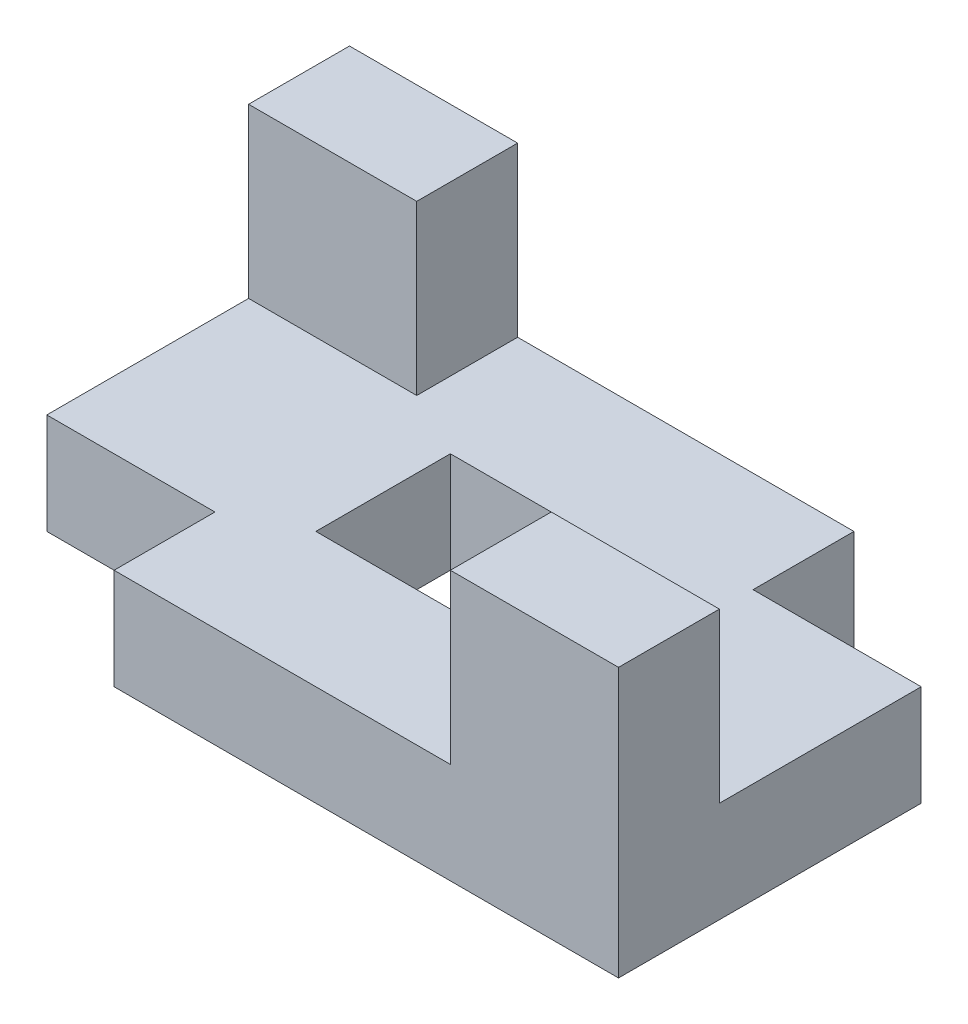
ISO-10303-21;
HEADER;
FILE_DESCRIPTION(('STEP AP214'),'2;1');
FILE_NAME('part.step','',(''),(''),'','','');
FILE_SCHEMA(('AUTOMOTIVE_DESIGN { 1 0 10303 214 1 1 1 1 }'));
ENDSEC;
DATA;
#1=APPLICATION_CONTEXT('core data for automotive mechanical design processes');
#2=APPLICATION_PROTOCOL_DEFINITION('international standard','automotive_design',2000,#1);
#3=PRODUCT_CONTEXT('',#1,'mechanical');
#4=PRODUCT('Part','Part','',(#3));
#5=PRODUCT_RELATED_PRODUCT_CATEGORY('part','',(#4));
#6=PRODUCT_DEFINITION_FORMATION('','',#4);
#7=PRODUCT_DEFINITION_CONTEXT('part definition',#1,'design');
#8=PRODUCT_DEFINITION('design','',#6,#7);
#9=PRODUCT_DEFINITION_SHAPE('','',#8);
#10=(LENGTH_UNIT() NAMED_UNIT(*) SI_UNIT(.MILLI.,.METRE.));
#11=(NAMED_UNIT(*) PLANE_ANGLE_UNIT() SI_UNIT($,.RADIAN.));
#12=(NAMED_UNIT(*) SI_UNIT($,.STERADIAN.) SOLID_ANGLE_UNIT());
#13=UNCERTAINTY_MEASURE_WITH_UNIT(LENGTH_MEASURE(1.E-05),#10,'distance_accuracy_value','');
#14=(GEOMETRIC_REPRESENTATION_CONTEXT(3) GLOBAL_UNCERTAINTY_ASSIGNED_CONTEXT((#13)) GLOBAL_UNIT_ASSIGNED_CONTEXT((#10,
#11,#12)) REPRESENTATION_CONTEXT('',''));
#15=CARTESIAN_POINT('',(0.,0.,0.));
#16=DIRECTION('',(0.,0.,1.));
#17=DIRECTION('',(1.,0.,0.));
#18=AXIS2_PLACEMENT_3D('',#15,#16,#17);
#19=CARTESIAN_POINT('',(-50.,15.,30.));
#20=DIRECTION('',(0.,0.,-1.));
#21=DIRECTION('',(-1.,0.,0.));
#22=AXIS2_PLACEMENT_3D('',#19,#20,#21);
#23=PLANE('',#22);
#24=DIRECTION('',(0.,1.,0.));
#25=VECTOR('',#24,1.);
#26=CARTESIAN_POINT('',(-25.,-8.,30.));
#27=LINE('',#26,#25);
#28=CARTESIAN_POINT('',(-25.,0.,30.));
#29=VERTEX_POINT('',#28);
#30=CARTESIAN_POINT('',(-25.,15.,30.));
#31=VERTEX_POINT('',#30);
#32=EDGE_CURVE('E203',#29,#31,#27,.T.);
#33=ORIENTED_EDGE('',*,*,#32,.F.);
#34=DIRECTION('',(1.,0.,0.));
#35=VECTOR('',#34,1.);
#36=CARTESIAN_POINT('',(-50.,0.,30.));
#37=LINE('',#36,#35);
#38=CARTESIAN_POINT('',(50.,0.,30.));
#39=VERTEX_POINT('',#38);
#40=EDGE_CURVE('E285',#29,#39,#37,.T.);
#41=ORIENTED_EDGE('',*,*,#40,.T.);
#42=DIRECTION('',(0.,-1.,0.));
#43=VECTOR('',#42,1.);
#44=CARTESIAN_POINT('',(50.,15.,30.));
#45=LINE('',#44,#43);
#46=CARTESIAN_POINT('',(50.,40.,30.));
#47=VERTEX_POINT('',#46);
#48=EDGE_CURVE('E292',#47,#39,#45,.T.);
#49=ORIENTED_EDGE('',*,*,#48,.F.);
#50=DIRECTION('',(1.,0.,0.));
#51=VECTOR('',#50,1.);
#52=CARTESIAN_POINT('',(50.,40.,30.));
#53=LINE('',#52,#51);
#54=CARTESIAN_POINT('',(25.,40.,30.));
#55=VERTEX_POINT('',#54);
#56=EDGE_CURVE('E255',#55,#47,#53,.T.);
#57=ORIENTED_EDGE('',*,*,#56,.F.);
#58=DIRECTION('',(0.,-1.,0.));
#59=VECTOR('',#58,1.);
#60=CARTESIAN_POINT('',(25.,40.,30.));
#61=LINE('',#60,#59);
#62=CARTESIAN_POINT('',(25.,15.,30.));
#63=VERTEX_POINT('',#62);
#64=EDGE_CURVE('E253',#55,#63,#61,.T.);
#65=ORIENTED_EDGE('',*,*,#64,.T.);
#66=DIRECTION('',(1.,0.,0.));
#67=VECTOR('',#66,1.);
#68=CARTESIAN_POINT('',(-50.,15.,30.));
#69=LINE('',#68,#67);
#70=EDGE_CURVE('E275',#31,#63,#69,.T.);
#71=ORIENTED_EDGE('',*,*,#70,.F.);
#72=EDGE_LOOP('',(#33,#41,#49,#57,#65,#71));
#73=FACE_BOUND('',#72,.T.);
#74=ADVANCED_FACE('F41',(#73),#23,.F.);
#75=CARTESIAN_POINT('',(50.,15.,-30.));
#76=DIRECTION('',(1.,0.,0.));
#77=DIRECTION('',(0.,0.,-1.));
#78=AXIS2_PLACEMENT_3D('',#75,#76,#77);
#79=PLANE('',#78);
#80=DIRECTION('',(0.,0.,1.));
#81=VECTOR('',#80,1.);
#82=CARTESIAN_POINT('',(50.,0.,-30.));
#83=LINE('',#82,#81);
#84=CARTESIAN_POINT('',(50.,0.,-15.));
#85=VERTEX_POINT('',#84);
#86=EDGE_CURVE('E282',#85,#39,#83,.T.);
#87=ORIENTED_EDGE('',*,*,#86,.F.);
#88=DIRECTION('',(0.,1.,0.));
#89=VECTOR('',#88,1.);
#90=CARTESIAN_POINT('',(50.,-8.,-15.));
#91=LINE('',#90,#89);
#92=CARTESIAN_POINT('',(50.,15.,-15.));
#93=VERTEX_POINT('',#92);
#94=EDGE_CURVE('E195',#85,#93,#91,.T.);
#95=ORIENTED_EDGE('',*,*,#94,.T.);
#96=DIRECTION('',(0.,0.,1.));
#97=VECTOR('',#96,1.);
#98=CARTESIAN_POINT('',(50.,15.,-30.));
#99=LINE('',#98,#97);
#100=CARTESIAN_POINT('',(50.,15.,15.));
#101=VERTEX_POINT('',#100);
#102=EDGE_CURVE('E274',#93,#101,#99,.T.);
#103=ORIENTED_EDGE('',*,*,#102,.T.);
#104=DIRECTION('',(0.,-1.,0.));
#105=VECTOR('',#104,1.);
#106=CARTESIAN_POINT('',(50.,40.,15.));
#107=LINE('',#106,#105);
#108=CARTESIAN_POINT('',(50.,40.,15.));
#109=VERTEX_POINT('',#108);
#110=EDGE_CURVE('E202',#109,#101,#107,.T.);
#111=ORIENTED_EDGE('',*,*,#110,.F.);
#112=DIRECTION('',(0.,0.,-1.));
#113=VECTOR('',#112,1.);
#114=CARTESIAN_POINT('',(50.,40.,30.));
#115=LINE('',#114,#113);
#116=EDGE_CURVE('E256',#47,#109,#115,.T.);
#117=ORIENTED_EDGE('',*,*,#116,.F.);
#118=ORIENTED_EDGE('',*,*,#48,.T.);
#119=EDGE_LOOP('',(#87,#95,#103,#111,#117,#118));
#120=FACE_BOUND('',#119,.T.);
#121=ADVANCED_FACE('F332',(#120),#79,.T.);
#122=CARTESIAN_POINT('',(-50.,15.,-30.));
#123=DIRECTION('',(1.,0.,0.));
#124=DIRECTION('',(0.,0.,-1.));
#125=AXIS2_PLACEMENT_3D('',#122,#123,#124);
#126=PLANE('',#125);
#127=DIRECTION('',(0.,0.,1.));
#128=VECTOR('',#127,1.);
#129=CARTESIAN_POINT('',(-50.,0.,-30.));
#130=LINE('',#129,#128);
#131=CARTESIAN_POINT('',(-50.,0.,-30.));
#132=VERTEX_POINT('',#131);
#133=CARTESIAN_POINT('',(-50.,0.,15.));
#134=VERTEX_POINT('',#133);
#135=EDGE_CURVE('E242',#132,#134,#130,.T.);
#136=ORIENTED_EDGE('',*,*,#135,.T.);
#137=DIRECTION('',(0.,1.,0.));
#138=VECTOR('',#137,1.);
#139=CARTESIAN_POINT('',(-50.,-8.,15.));
#140=LINE('',#139,#138);
#141=CARTESIAN_POINT('',(-50.,15.,15.));
#142=VERTEX_POINT('',#141);
#143=EDGE_CURVE('E205',#134,#142,#140,.T.);
#144=ORIENTED_EDGE('',*,*,#143,.T.);
#145=DIRECTION('',(0.,0.,1.));
#146=VECTOR('',#145,1.);
#147=CARTESIAN_POINT('',(-50.,15.,-30.));
#148=LINE('',#147,#146);
#149=CARTESIAN_POINT('',(-50.,15.,-15.));
#150=VERTEX_POINT('',#149);
#151=EDGE_CURVE('E267',#150,#142,#148,.T.);
#152=ORIENTED_EDGE('',*,*,#151,.F.);
#153=DIRECTION('',(0.,-1.,0.));
#154=VECTOR('',#153,1.);
#155=CARTESIAN_POINT('',(-50.,40.,-15.));
#156=LINE('',#155,#154);
#157=CARTESIAN_POINT('',(-50.,40.,-15.));
#158=VERTEX_POINT('',#157);
#159=EDGE_CURVE('E241',#158,#150,#156,.T.);
#160=ORIENTED_EDGE('',*,*,#159,.F.);
#161=DIRECTION('',(0.,0.,1.));
#162=VECTOR('',#161,1.);
#163=CARTESIAN_POINT('',(-50.,40.,-30.));
#164=LINE('',#163,#162);
#165=CARTESIAN_POINT('',(-50.,40.,-30.));
#166=VERTEX_POINT('',#165);
#167=EDGE_CURVE('E218',#166,#158,#164,.T.);
#168=ORIENTED_EDGE('',*,*,#167,.F.);
#169=DIRECTION('',(0.,-1.,0.));
#170=VECTOR('',#169,1.);
#171=CARTESIAN_POINT('',(-50.,15.,-30.));
#172=LINE('',#171,#170);
#173=EDGE_CURVE('E278',#166,#132,#172,.T.);
#174=ORIENTED_EDGE('',*,*,#173,.T.);
#175=EDGE_LOOP('',(#136,#144,#152,#160,#168,#174));
#176=FACE_BOUND('',#175,.T.);
#177=ADVANCED_FACE('F43',(#176),#126,.F.);
#178=CARTESIAN_POINT('',(-50.,15.,-30.));
#179=DIRECTION('',(0.,0.,-1.));
#180=DIRECTION('',(-1.,0.,0.));
#181=AXIS2_PLACEMENT_3D('',#178,#179,#180);
#182=PLANE('',#181);
#183=DIRECTION('',(0.,1.,0.));
#184=VECTOR('',#183,1.);
#185=CARTESIAN_POINT('',(25.,-8.,-30.));
#186=LINE('',#185,#184);
#187=CARTESIAN_POINT('',(25.,0.,-30.));
#188=VERTEX_POINT('',#187);
#189=CARTESIAN_POINT('',(25.,15.,-30.));
#190=VERTEX_POINT('',#189);
#191=EDGE_CURVE('E207',#188,#190,#186,.T.);
#192=ORIENTED_EDGE('',*,*,#191,.F.);
#193=DIRECTION('',(1.,0.,0.));
#194=VECTOR('',#193,1.);
#195=CARTESIAN_POINT('',(-50.,0.,-30.));
#196=LINE('',#195,#194);
#197=EDGE_CURVE('E272',#132,#188,#196,.T.);
#198=ORIENTED_EDGE('',*,*,#197,.F.);
#199=ORIENTED_EDGE('',*,*,#173,.F.);
#200=DIRECTION('',(-1.,0.,0.));
#201=VECTOR('',#200,1.);
#202=CARTESIAN_POINT('',(-50.,40.,-30.));
#203=LINE('',#202,#201);
#204=CARTESIAN_POINT('',(-25.,40.,-30.));
#205=VERTEX_POINT('',#204);
#206=EDGE_CURVE('E226',#205,#166,#203,.T.);
#207=ORIENTED_EDGE('',*,*,#206,.F.);
#208=DIRECTION('',(0.,-1.,0.));
#209=VECTOR('',#208,1.);
#210=CARTESIAN_POINT('',(-25.,40.,-30.));
#211=LINE('',#210,#209);
#212=CARTESIAN_POINT('',(-25.,15.,-30.));
#213=VERTEX_POINT('',#212);
#214=EDGE_CURVE('E227',#205,#213,#211,.T.);
#215=ORIENTED_EDGE('',*,*,#214,.T.);
#216=DIRECTION('',(1.,0.,0.));
#217=VECTOR('',#216,1.);
#218=CARTESIAN_POINT('',(-50.,15.,-30.));
#219=LINE('',#218,#217);
#220=EDGE_CURVE('E280',#213,#190,#219,.T.);
#221=ORIENTED_EDGE('',*,*,#220,.T.);
#222=EDGE_LOOP('',(#192,#198,#199,#207,#215,#221));
#223=FACE_BOUND('',#222,.T.);
#224=ADVANCED_FACE('F341',(#223),#182,.T.);
#225=CARTESIAN_POINT('',(0.,15.,0.));
#226=DIRECTION('',(0.,1.,0.));
#227=DIRECTION('',(0.,0.,1.));
#228=AXIS2_PLACEMENT_3D('',#225,#226,#227);
#229=PLANE('',#228);
#230=DIRECTION('',(0.,0.,1.));
#231=VECTOR('',#230,1.);
#232=CARTESIAN_POINT('',(-15.,15.,-10.));
#233=LINE('',#232,#231);
#234=CARTESIAN_POINT('',(-15.,15.,-10.));
#235=VERTEX_POINT('',#234);
#236=CARTESIAN_POINT('',(-15.,15.,10.));
#237=VERTEX_POINT('',#236);
#238=EDGE_CURVE('E57',#235,#237,#233,.T.);
#239=ORIENTED_EDGE('',*,*,#238,.F.);
#240=DIRECTION('',(1.,0.,0.));
#241=VECTOR('',#240,1.);
#242=CARTESIAN_POINT('',(-15.,15.,-10.));
#243=LINE('',#242,#241);
#244=CARTESIAN_POINT('',(15.,15.,-10.));
#245=VERTEX_POINT('',#244);
#246=EDGE_CURVE('E183',#235,#245,#243,.T.);
#247=ORIENTED_EDGE('',*,*,#246,.T.);
#248=DIRECTION('',(0.,0.,1.));
#249=VECTOR('',#248,1.);
#250=CARTESIAN_POINT('',(15.,15.,-10.));
#251=LINE('',#250,#249);
#252=CARTESIAN_POINT('',(15.,15.,10.));
#253=VERTEX_POINT('',#252);
#254=EDGE_CURVE('E166',#245,#253,#251,.T.);
#255=ORIENTED_EDGE('',*,*,#254,.T.);
#256=DIRECTION('',(1.,0.,0.));
#257=VECTOR('',#256,1.);
#258=CARTESIAN_POINT('',(-15.,15.,10.));
#259=LINE('',#258,#257);
#260=EDGE_CURVE('E177',#237,#253,#259,.T.);
#261=ORIENTED_EDGE('',*,*,#260,.F.);
#262=EDGE_LOOP('',(#239,#247,#255,#261));
#263=FACE_BOUND('',#262,.T.);
#264=DIRECTION('',(0.,0.,-1.));
#265=VECTOR('',#264,1.);
#266=CARTESIAN_POINT('',(-25.,15.,30.));
#267=LINE('',#266,#265);
#268=CARTESIAN_POINT('',(-25.,15.,15.));
#269=VERTEX_POINT('',#268);
#270=EDGE_CURVE('E194',#31,#269,#267,.T.);
#271=ORIENTED_EDGE('',*,*,#270,.F.);
#272=ORIENTED_EDGE('',*,*,#70,.T.);
#273=DIRECTION('',(0.,0.,1.));
#274=VECTOR('',#273,1.);
#275=CARTESIAN_POINT('',(25.,15.,30.));
#276=LINE('',#275,#274);
#277=CARTESIAN_POINT('',(25.,15.,15.));
#278=VERTEX_POINT('',#277);
#279=EDGE_CURVE('E254',#278,#63,#276,.T.);
#280=ORIENTED_EDGE('',*,*,#279,.F.);
#281=DIRECTION('',(-1.,0.,0.));
#282=VECTOR('',#281,1.);
#283=CARTESIAN_POINT('',(50.,15.,15.));
#284=LINE('',#283,#282);
#285=EDGE_CURVE('E233',#101,#278,#284,.T.);
#286=ORIENTED_EDGE('',*,*,#285,.F.);
#287=ORIENTED_EDGE('',*,*,#102,.F.);
#288=DIRECTION('',(1.,0.,0.));
#289=VECTOR('',#288,1.);
#290=CARTESIAN_POINT('',(50.,15.,-15.));
#291=LINE('',#290,#289);
#292=CARTESIAN_POINT('',(25.,15.,-15.));
#293=VERTEX_POINT('',#292);
#294=EDGE_CURVE('E211',#293,#93,#291,.T.);
#295=ORIENTED_EDGE('',*,*,#294,.F.);
#296=DIRECTION('',(0.,0.,1.));
#297=VECTOR('',#296,1.);
#298=CARTESIAN_POINT('',(25.,15.,-30.));
#299=LINE('',#298,#297);
#300=EDGE_CURVE('E200',#190,#293,#299,.T.);
#301=ORIENTED_EDGE('',*,*,#300,.F.);
#302=ORIENTED_EDGE('',*,*,#220,.F.);
#303=DIRECTION('',(0.,0.,-1.));
#304=VECTOR('',#303,1.);
#305=CARTESIAN_POINT('',(-25.,15.,-30.));
#306=LINE('',#305,#304);
#307=CARTESIAN_POINT('',(-25.,15.,-15.));
#308=VERTEX_POINT('',#307);
#309=EDGE_CURVE('E224',#308,#213,#306,.T.);
#310=ORIENTED_EDGE('',*,*,#309,.F.);
#311=DIRECTION('',(1.,0.,0.));
#312=VECTOR('',#311,1.);
#313=CARTESIAN_POINT('',(-50.,15.,-15.));
#314=LINE('',#313,#312);
#315=EDGE_CURVE('E231',#150,#308,#314,.T.);
#316=ORIENTED_EDGE('',*,*,#315,.F.);
#317=ORIENTED_EDGE('',*,*,#151,.T.);
#318=DIRECTION('',(-1.,0.,0.));
#319=VECTOR('',#318,1.);
#320=CARTESIAN_POINT('',(-50.,15.,15.));
#321=LINE('',#320,#319);
#322=EDGE_CURVE('E196',#269,#142,#321,.T.);
#323=ORIENTED_EDGE('',*,*,#322,.F.);
#324=EDGE_LOOP('',(#271,#272,#280,#286,#287,#295,#301,#302,#310,#316,#317,#323));
#325=FACE_BOUND('',#324,.T.);
#326=ADVANCED_FACE('F185',(#263,#325),#229,.T.);
#327=CARTESIAN_POINT('',(0.,0.,0.));
#328=DIRECTION('',(0.,1.,0.));
#329=DIRECTION('',(0.,0.,1.));
#330=AXIS2_PLACEMENT_3D('',#327,#328,#329);
#331=PLANE('',#330);
#332=DIRECTION('',(1.,0.,0.));
#333=VECTOR('',#332,1.);
#334=CARTESIAN_POINT('',(0.,0.,-10.));
#335=LINE('',#334,#333);
#336=CARTESIAN_POINT('',(-15.,0.,-10.));
#337=VERTEX_POINT('',#336);
#338=CARTESIAN_POINT('',(15.,0.,-10.));
#339=VERTEX_POINT('',#338);
#340=EDGE_CURVE('E47',#337,#339,#335,.T.);
#341=ORIENTED_EDGE('',*,*,#340,.F.);
#342=DIRECTION('',(0.,0.,1.));
#343=VECTOR('',#342,1.);
#344=CARTESIAN_POINT('',(-15.,0.,0.));
#345=LINE('',#344,#343);
#346=CARTESIAN_POINT('',(-15.,0.,10.));
#347=VERTEX_POINT('',#346);
#348=EDGE_CURVE('E11',#337,#347,#345,.T.);
#349=ORIENTED_EDGE('',*,*,#348,.T.);
#350=DIRECTION('',(1.,0.,0.));
#351=VECTOR('',#350,1.);
#352=CARTESIAN_POINT('',(0.,0.,10.));
#353=LINE('',#352,#351);
#354=CARTESIAN_POINT('',(15.,0.,10.));
#355=VERTEX_POINT('',#354);
#356=EDGE_CURVE('E308',#347,#355,#353,.T.);
#357=ORIENTED_EDGE('',*,*,#356,.T.);
#358=DIRECTION('',(0.,0.,1.));
#359=VECTOR('',#358,1.);
#360=CARTESIAN_POINT('',(15.,0.,0.));
#361=LINE('',#360,#359);
#362=EDGE_CURVE('E171',#339,#355,#361,.T.);
#363=ORIENTED_EDGE('',*,*,#362,.F.);
#364=EDGE_LOOP('',(#341,#349,#357,#363));
#365=FACE_BOUND('',#364,.T.);
#366=DIRECTION('',(0.,0.,-1.));
#367=VECTOR('',#366,1.);
#368=CARTESIAN_POINT('',(-25.,0.,0.));
#369=LINE('',#368,#367);
#370=CARTESIAN_POINT('',(-25.,0.,15.));
#371=VERTEX_POINT('',#370);
#372=EDGE_CURVE('E297',#29,#371,#369,.T.);
#373=ORIENTED_EDGE('',*,*,#372,.T.);
#374=DIRECTION('',(-1.,0.,0.));
#375=VECTOR('',#374,1.);
#376=CARTESIAN_POINT('',(0.,0.,15.));
#377=LINE('',#376,#375);
#378=EDGE_CURVE('E302',#371,#134,#377,.T.);
#379=ORIENTED_EDGE('',*,*,#378,.T.);
#380=ORIENTED_EDGE('',*,*,#135,.F.);
#381=ORIENTED_EDGE('',*,*,#197,.T.);
#382=DIRECTION('',(0.,0.,1.));
#383=VECTOR('',#382,1.);
#384=CARTESIAN_POINT('',(25.,0.,0.));
#385=LINE('',#384,#383);
#386=CARTESIAN_POINT('',(25.,0.,-15.));
#387=VERTEX_POINT('',#386);
#388=EDGE_CURVE('E294',#188,#387,#385,.T.);
#389=ORIENTED_EDGE('',*,*,#388,.T.);
#390=DIRECTION('',(1.,0.,0.));
#391=VECTOR('',#390,1.);
#392=CARTESIAN_POINT('',(0.,0.,-15.));
#393=LINE('',#392,#391);
#394=EDGE_CURVE('E296',#387,#85,#393,.T.);
#395=ORIENTED_EDGE('',*,*,#394,.T.);
#396=ORIENTED_EDGE('',*,*,#86,.T.);
#397=ORIENTED_EDGE('',*,*,#40,.F.);
#398=EDGE_LOOP('',(#373,#379,#380,#381,#389,#395,#396,#397));
#399=FACE_BOUND('',#398,.T.);
#400=ADVANCED_FACE('F311',(#365,#399),#331,.F.);
#401=CARTESIAN_POINT('',(50.,40.,15.));
#402=DIRECTION('',(0.,0.,1.));
#403=DIRECTION('',(1.,0.,0.));
#404=AXIS2_PLACEMENT_3D('',#401,#402,#403);
#405=PLANE('',#404);
#406=ORIENTED_EDGE('',*,*,#285,.T.);
#407=DIRECTION('',(0.,-1.,0.));
#408=VECTOR('',#407,1.);
#409=CARTESIAN_POINT('',(25.,40.,15.));
#410=LINE('',#409,#408);
#411=CARTESIAN_POINT('',(25.,40.,15.));
#412=VERTEX_POINT('',#411);
#413=EDGE_CURVE('E247',#412,#278,#410,.T.);
#414=ORIENTED_EDGE('',*,*,#413,.F.);
#415=DIRECTION('',(-1.,0.,0.));
#416=VECTOR('',#415,1.);
#417=CARTESIAN_POINT('',(50.,40.,15.));
#418=LINE('',#417,#416);
#419=EDGE_CURVE('E264',#109,#412,#418,.T.);
#420=ORIENTED_EDGE('',*,*,#419,.F.);
#421=ORIENTED_EDGE('',*,*,#110,.T.);
#422=EDGE_LOOP('',(#406,#414,#420,#421));
#423=FACE_BOUND('',#422,.T.);
#424=ADVANCED_FACE('F347',(#423),#405,.F.);
#425=CARTESIAN_POINT('',(25.,40.,30.));
#426=DIRECTION('',(1.,0.,0.));
#427=DIRECTION('',(0.,0.,-1.));
#428=AXIS2_PLACEMENT_3D('',#425,#426,#427);
#429=PLANE('',#428);
#430=ORIENTED_EDGE('',*,*,#279,.T.);
#431=ORIENTED_EDGE('',*,*,#64,.F.);
#432=DIRECTION('',(0.,0.,1.));
#433=VECTOR('',#432,1.);
#434=CARTESIAN_POINT('',(25.,40.,30.));
#435=LINE('',#434,#433);
#436=EDGE_CURVE('E263',#412,#55,#435,.T.);
#437=ORIENTED_EDGE('',*,*,#436,.F.);
#438=ORIENTED_EDGE('',*,*,#413,.T.);
#439=EDGE_LOOP('',(#430,#431,#437,#438));
#440=FACE_BOUND('',#439,.T.);
#441=ADVANCED_FACE('F355',(#440),#429,.F.);
#442=CARTESIAN_POINT('',(0.,40.,0.));
#443=DIRECTION('',(0.,1.,0.));
#444=DIRECTION('',(0.,0.,1.));
#445=AXIS2_PLACEMENT_3D('',#442,#443,#444);
#446=PLANE('',#445);
#447=ORIENTED_EDGE('',*,*,#116,.T.);
#448=ORIENTED_EDGE('',*,*,#419,.T.);
#449=ORIENTED_EDGE('',*,*,#436,.T.);
#450=ORIENTED_EDGE('',*,*,#56,.T.);
#451=EDGE_LOOP('',(#447,#448,#449,#450));
#452=FACE_BOUND('',#451,.T.);
#453=ADVANCED_FACE('F349',(#452),#446,.T.);
#454=CARTESIAN_POINT('',(-50.,40.,-15.));
#455=DIRECTION('',(0.,0.,-1.));
#456=DIRECTION('',(-1.,0.,0.));
#457=AXIS2_PLACEMENT_3D('',#454,#455,#456);
#458=PLANE('',#457);
#459=ORIENTED_EDGE('',*,*,#315,.T.);
#460=DIRECTION('',(0.,-1.,0.));
#461=VECTOR('',#460,1.);
#462=CARTESIAN_POINT('',(-25.,40.,-15.));
#463=LINE('',#462,#461);
#464=CARTESIAN_POINT('',(-25.,40.,-15.));
#465=VERTEX_POINT('',#464);
#466=EDGE_CURVE('E239',#465,#308,#463,.T.);
#467=ORIENTED_EDGE('',*,*,#466,.F.);
#468=DIRECTION('',(1.,0.,0.));
#469=VECTOR('',#468,1.);
#470=CARTESIAN_POINT('',(-50.,40.,-15.));
#471=LINE('',#470,#469);
#472=EDGE_CURVE('E225',#158,#465,#471,.T.);
#473=ORIENTED_EDGE('',*,*,#472,.F.);
#474=ORIENTED_EDGE('',*,*,#159,.T.);
#475=EDGE_LOOP('',(#459,#467,#473,#474));
#476=FACE_BOUND('',#475,.T.);
#477=ADVANCED_FACE('F351',(#476),#458,.F.);
#478=CARTESIAN_POINT('',(-25.,40.,-30.));
#479=DIRECTION('',(-1.,0.,0.));
#480=DIRECTION('',(0.,0.,1.));
#481=AXIS2_PLACEMENT_3D('',#478,#479,#480);
#482=PLANE('',#481);
#483=ORIENTED_EDGE('',*,*,#309,.T.);
#484=ORIENTED_EDGE('',*,*,#214,.F.);
#485=DIRECTION('',(0.,0.,-1.));
#486=VECTOR('',#485,1.);
#487=CARTESIAN_POINT('',(-25.,40.,-30.));
#488=LINE('',#487,#486);
#489=EDGE_CURVE('E223',#465,#205,#488,.T.);
#490=ORIENTED_EDGE('',*,*,#489,.F.);
#491=ORIENTED_EDGE('',*,*,#466,.T.);
#492=EDGE_LOOP('',(#483,#484,#490,#491));
#493=FACE_BOUND('',#492,.T.);
#494=ADVANCED_FACE('F361',(#493),#482,.F.);
#495=CARTESIAN_POINT('',(0.,40.,0.));
#496=DIRECTION('',(0.,1.,0.));
#497=DIRECTION('',(0.,0.,1.));
#498=AXIS2_PLACEMENT_3D('',#495,#496,#497);
#499=PLANE('',#498);
#500=ORIENTED_EDGE('',*,*,#167,.T.);
#501=ORIENTED_EDGE('',*,*,#472,.T.);
#502=ORIENTED_EDGE('',*,*,#489,.T.);
#503=ORIENTED_EDGE('',*,*,#206,.T.);
#504=EDGE_LOOP('',(#500,#501,#502,#503));
#505=FACE_BOUND('',#504,.T.);
#506=ADVANCED_FACE('F370',(#505),#499,.T.);
#507=CARTESIAN_POINT('',(50.,-8.,-15.));
#508=DIRECTION('',(0.,0.,1.));
#509=DIRECTION('',(1.,0.,0.));
#510=AXIS2_PLACEMENT_3D('',#507,#508,#509);
#511=PLANE('',#510);
#512=DIRECTION('',(0.,1.,0.));
#513=VECTOR('',#512,1.);
#514=CARTESIAN_POINT('',(25.,-8.,-15.));
#515=LINE('',#514,#513);
#516=EDGE_CURVE('E215',#387,#293,#515,.T.);
#517=ORIENTED_EDGE('',*,*,#516,.T.);
#518=ORIENTED_EDGE('',*,*,#294,.T.);
#519=ORIENTED_EDGE('',*,*,#94,.F.);
#520=ORIENTED_EDGE('',*,*,#394,.F.);
#521=EDGE_LOOP('',(#517,#518,#519,#520));
#522=FACE_BOUND('',#521,.T.);
#523=ADVANCED_FACE('F371',(#522),#511,.F.);
#524=CARTESIAN_POINT('',(25.,-8.,-30.));
#525=DIRECTION('',(-1.,0.,0.));
#526=DIRECTION('',(0.,0.,1.));
#527=AXIS2_PLACEMENT_3D('',#524,#525,#526);
#528=PLANE('',#527);
#529=ORIENTED_EDGE('',*,*,#191,.T.);
#530=ORIENTED_EDGE('',*,*,#300,.T.);
#531=ORIENTED_EDGE('',*,*,#516,.F.);
#532=ORIENTED_EDGE('',*,*,#388,.F.);
#533=EDGE_LOOP('',(#529,#530,#531,#532));
#534=FACE_BOUND('',#533,.T.);
#535=ADVANCED_FACE('F374',(#534),#528,.F.);
#536=CARTESIAN_POINT('',(-50.,-8.,15.));
#537=DIRECTION('',(0.,0.,-1.));
#538=DIRECTION('',(-1.,0.,0.));
#539=AXIS2_PLACEMENT_3D('',#536,#537,#538);
#540=PLANE('',#539);
#541=DIRECTION('',(0.,1.,0.));
#542=VECTOR('',#541,1.);
#543=CARTESIAN_POINT('',(-25.,-8.,15.));
#544=LINE('',#543,#542);
#545=EDGE_CURVE('E206',#371,#269,#544,.T.);
#546=ORIENTED_EDGE('',*,*,#545,.T.);
#547=ORIENTED_EDGE('',*,*,#322,.T.);
#548=ORIENTED_EDGE('',*,*,#143,.F.);
#549=ORIENTED_EDGE('',*,*,#378,.F.);
#550=EDGE_LOOP('',(#546,#547,#548,#549));
#551=FACE_BOUND('',#550,.T.);
#552=ADVANCED_FACE('F324',(#551),#540,.F.);
#553=CARTESIAN_POINT('',(-25.,-8.,30.));
#554=DIRECTION('',(1.,0.,0.));
#555=DIRECTION('',(0.,0.,-1.));
#556=AXIS2_PLACEMENT_3D('',#553,#554,#555);
#557=PLANE('',#556);
#558=ORIENTED_EDGE('',*,*,#32,.T.);
#559=ORIENTED_EDGE('',*,*,#270,.T.);
#560=ORIENTED_EDGE('',*,*,#545,.F.);
#561=ORIENTED_EDGE('',*,*,#372,.F.);
#562=EDGE_LOOP('',(#558,#559,#560,#561));
#563=FACE_BOUND('',#562,.T.);
#564=ADVANCED_FACE('F320',(#563),#557,.F.);
#565=CARTESIAN_POINT('',(-15.,-30.,-10.));
#566=DIRECTION('',(-1.,0.,0.));
#567=DIRECTION('',(0.,0.,1.));
#568=AXIS2_PLACEMENT_3D('',#565,#566,#567);
#569=PLANE('',#568);
#570=DIRECTION('',(0.,1.,0.));
#571=VECTOR('',#570,1.);
#572=CARTESIAN_POINT('',(-15.,-30.,-10.));
#573=LINE('',#572,#571);
#574=EDGE_CURVE('E187',#337,#235,#573,.T.);
#575=ORIENTED_EDGE('',*,*,#574,.T.);
#576=ORIENTED_EDGE('',*,*,#238,.T.);
#577=DIRECTION('',(0.,1.,0.));
#578=VECTOR('',#577,1.);
#579=CARTESIAN_POINT('',(-15.,-30.,10.));
#580=LINE('',#579,#578);
#581=EDGE_CURVE('E172',#347,#237,#580,.T.);
#582=ORIENTED_EDGE('',*,*,#581,.F.);
#583=ORIENTED_EDGE('',*,*,#348,.F.);
#584=EDGE_LOOP('',(#575,#576,#582,#583));
#585=FACE_BOUND('',#584,.T.);
#586=ADVANCED_FACE('F312',(#585),#569,.F.);
#587=CARTESIAN_POINT('',(-15.,-30.,-10.));
#588=DIRECTION('',(0.,0.,1.));
#589=DIRECTION('',(1.,0.,0.));
#590=AXIS2_PLACEMENT_3D('',#587,#588,#589);
#591=PLANE('',#590);
#592=ORIENTED_EDGE('',*,*,#340,.T.);
#593=DIRECTION('',(0.,1.,0.));
#594=VECTOR('',#593,1.);
#595=CARTESIAN_POINT('',(15.,-30.,-10.));
#596=LINE('',#595,#594);
#597=EDGE_CURVE('E173',#339,#245,#596,.T.);
#598=ORIENTED_EDGE('',*,*,#597,.T.);
#599=ORIENTED_EDGE('',*,*,#246,.F.);
#600=ORIENTED_EDGE('',*,*,#574,.F.);
#601=EDGE_LOOP('',(#592,#598,#599,#600));
#602=FACE_BOUND('',#601,.T.);
#603=ADVANCED_FACE('F313',(#602),#591,.T.);
#604=CARTESIAN_POINT('',(15.,-30.,-10.));
#605=DIRECTION('',(-1.,0.,0.));
#606=DIRECTION('',(0.,0.,1.));
#607=AXIS2_PLACEMENT_3D('',#604,#605,#606);
#608=PLANE('',#607);
#609=ORIENTED_EDGE('',*,*,#362,.T.);
#610=DIRECTION('',(0.,1.,0.));
#611=VECTOR('',#610,1.);
#612=CARTESIAN_POINT('',(15.,-30.,10.));
#613=LINE('',#612,#611);
#614=EDGE_CURVE('E63',#355,#253,#613,.T.);
#615=ORIENTED_EDGE('',*,*,#614,.T.);
#616=ORIENTED_EDGE('',*,*,#254,.F.);
#617=ORIENTED_EDGE('',*,*,#597,.F.);
#618=EDGE_LOOP('',(#609,#615,#616,#617));
#619=FACE_BOUND('',#618,.T.);
#620=ADVANCED_FACE('F167',(#619),#608,.T.);
#621=CARTESIAN_POINT('',(-15.,-30.,10.));
#622=DIRECTION('',(0.,0.,1.));
#623=DIRECTION('',(1.,0.,0.));
#624=AXIS2_PLACEMENT_3D('',#621,#622,#623);
#625=PLANE('',#624);
#626=ORIENTED_EDGE('',*,*,#581,.T.);
#627=ORIENTED_EDGE('',*,*,#260,.T.);
#628=ORIENTED_EDGE('',*,*,#614,.F.);
#629=ORIENTED_EDGE('',*,*,#356,.F.);
#630=EDGE_LOOP('',(#626,#627,#628,#629));
#631=FACE_BOUND('',#630,.T.);
#632=ADVANCED_FACE('F178',(#631),#625,.F.);
#633=CLOSED_SHELL('',(#74,#121,#177,#224,#326,#400,#424,#441,#453,#477,#494,#506,#523,#535,#552,
#564,#586,#603,#620,#632));
#634=MANIFOLD_SOLID_BREP('B2',#633);
#635=ADVANCED_BREP_SHAPE_REPRESENTATION('',(#18,#634),#14);
#636=SHAPE_DEFINITION_REPRESENTATION(#9,#635);
ENDSEC;
END-ISO-10303-21;
